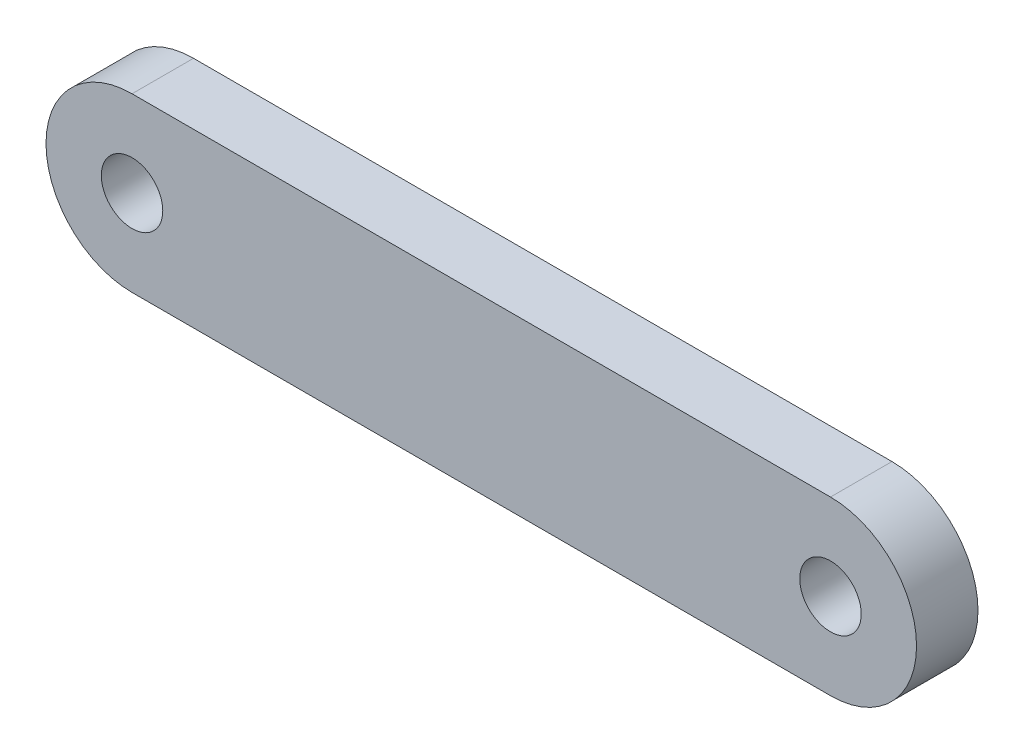
ISO-10303-21;
HEADER;
FILE_DESCRIPTION(('STEP AP214'),'2;1');
FILE_NAME('part.step','',(''),(''),'','','');
FILE_SCHEMA(('AUTOMOTIVE_DESIGN { 1 0 10303 214 1 1 1 1 }'));
ENDSEC;
DATA;
#1=APPLICATION_CONTEXT('core data for automotive mechanical design processes');
#2=APPLICATION_PROTOCOL_DEFINITION('international standard','automotive_design',2000,#1);
#3=PRODUCT_CONTEXT('',#1,'mechanical');
#4=PRODUCT('Part','Part','',(#3));
#5=PRODUCT_RELATED_PRODUCT_CATEGORY('part','',(#4));
#6=PRODUCT_DEFINITION_FORMATION('','',#4);
#7=PRODUCT_DEFINITION_CONTEXT('part definition',#1,'design');
#8=PRODUCT_DEFINITION('design','',#6,#7);
#9=PRODUCT_DEFINITION_SHAPE('','',#8);
#10=(LENGTH_UNIT() NAMED_UNIT(*) SI_UNIT(.MILLI.,.METRE.));
#11=(NAMED_UNIT(*) PLANE_ANGLE_UNIT() SI_UNIT($,.RADIAN.));
#12=(NAMED_UNIT(*) SI_UNIT($,.STERADIAN.) SOLID_ANGLE_UNIT());
#13=UNCERTAINTY_MEASURE_WITH_UNIT(LENGTH_MEASURE(1.E-05),#10,'distance_accuracy_value','');
#14=(GEOMETRIC_REPRESENTATION_CONTEXT(3) GLOBAL_UNCERTAINTY_ASSIGNED_CONTEXT((#13)) GLOBAL_UNIT_ASSIGNED_CONTEXT((#10,
#11,#12)) REPRESENTATION_CONTEXT('',''));
#15=CARTESIAN_POINT('',(0.,0.,0.));
#16=DIRECTION('',(0.,0.,1.));
#17=DIRECTION('',(1.,0.,0.));
#18=AXIS2_PLACEMENT_3D('',#15,#16,#17);
#19=CARTESIAN_POINT('',(53.4568064793297,0.253504378838441,6.35));
#20=DIRECTION('',(0.,0.,-1.));
#21=DIRECTION('',(-1.,0.,0.));
#22=AXIS2_PLACEMENT_3D('',#19,#20,#21);
#23=PLANE('',#22);
#24=CARTESIAN_POINT('',(53.4568064793297,0.253504378838441,6.35));
#25=DIRECTION('',(0.,0.,1.));
#26=DIRECTION('',(-1.,0.,0.));
#27=AXIS2_PLACEMENT_3D('',#24,#25,#26);
#28=CIRCLE('',#27,8.89);
#29=CARTESIAN_POINT('',(53.4568064793297,-8.63649562116156,6.35));
#30=VERTEX_POINT('',#29);
#31=CARTESIAN_POINT('',(53.4568064793297,9.14350437883844,6.35));
#32=VERTEX_POINT('',#31);
#33=EDGE_CURVE('E93',#30,#32,#28,.T.);
#34=ORIENTED_EDGE('',*,*,#33,.T.);
#35=DIRECTION('',(-1.,0.,0.));
#36=VECTOR('',#35,1.);
#37=CARTESIAN_POINT('',(-18.7121935206703,9.14350437883844,6.35));
#38=LINE('',#37,#36);
#39=CARTESIAN_POINT('',(-18.7121935206703,9.14350437883844,6.35));
#40=VERTEX_POINT('',#39);
#41=EDGE_CURVE('E88',#32,#40,#38,.T.);
#42=ORIENTED_EDGE('',*,*,#41,.T.);
#43=CARTESIAN_POINT('',(-18.7121935206703,0.253504378838441,6.35));
#44=DIRECTION('',(0.,0.,1.));
#45=DIRECTION('',(1.,0.,0.));
#46=AXIS2_PLACEMENT_3D('',#43,#44,#45);
#47=CIRCLE('',#46,8.89);
#48=CARTESIAN_POINT('',(-18.7121935206703,-8.63649562116156,6.35));
#49=VERTEX_POINT('',#48);
#50=EDGE_CURVE('E90',#40,#49,#47,.T.);
#51=ORIENTED_EDGE('',*,*,#50,.T.);
#52=DIRECTION('',(1.,0.,0.));
#53=VECTOR('',#52,1.);
#54=CARTESIAN_POINT('',(-18.7121935206703,-8.63649562116156,6.35));
#55=LINE('',#54,#53);
#56=EDGE_CURVE('E57',#49,#30,#55,.T.);
#57=ORIENTED_EDGE('',*,*,#56,.T.);
#58=EDGE_LOOP('',(#34,#42,#51,#57));
#59=FACE_BOUND('',#58,.T.);
#60=CARTESIAN_POINT('',(-18.7121935206703,0.253504378838441,6.35));
#61=DIRECTION('',(0.,0.,1.));
#62=DIRECTION('',(1.,0.,0.));
#63=AXIS2_PLACEMENT_3D('',#60,#61,#62);
#64=CIRCLE('',#63,3.175);
#65=CARTESIAN_POINT('',(-15.5371935206703,0.253504378838441,6.35));
#66=VERTEX_POINT('',#65);
#67=EDGE_CURVE('E106',#66,#66,#64,.T.);
#68=ORIENTED_EDGE('',*,*,#67,.F.);
#69=EDGE_LOOP('',(#68));
#70=FACE_BOUND('',#69,.T.);
#71=CARTESIAN_POINT('',(53.4568064793297,0.253504378838441,6.35));
#72=DIRECTION('',(0.,0.,1.));
#73=DIRECTION('',(1.,0.,0.));
#74=AXIS2_PLACEMENT_3D('',#71,#72,#73);
#75=CIRCLE('',#74,3.175);
#76=CARTESIAN_POINT('',(56.6318064793297,0.253504378838441,6.35));
#77=VERTEX_POINT('',#76);
#78=EDGE_CURVE('E122',#77,#77,#75,.T.);
#79=ORIENTED_EDGE('',*,*,#78,.F.);
#80=EDGE_LOOP('',(#79));
#81=FACE_BOUND('',#80,.T.);
#82=ADVANCED_FACE('F39',(#59,#70,#81),#23,.F.);
#83=CARTESIAN_POINT('',(53.4568064793297,0.253504378838441,0.));
#84=DIRECTION('',(0.,0.,-1.));
#85=DIRECTION('',(-1.,0.,0.));
#86=AXIS2_PLACEMENT_3D('',#83,#84,#85);
#87=PLANE('',#86);
#88=CARTESIAN_POINT('',(-18.7121935206703,0.253504378838441,0.));
#89=DIRECTION('',(0.,0.,1.));
#90=DIRECTION('',(1.,0.,0.));
#91=AXIS2_PLACEMENT_3D('',#88,#89,#90);
#92=CIRCLE('',#91,3.175);
#93=CARTESIAN_POINT('',(-15.5371935206703,0.253504378838441,0.));
#94=VERTEX_POINT('',#93);
#95=EDGE_CURVE('E120',#94,#94,#92,.T.);
#96=ORIENTED_EDGE('',*,*,#95,.T.);
#97=EDGE_LOOP('',(#96));
#98=FACE_BOUND('',#97,.T.);
#99=CARTESIAN_POINT('',(53.4568064793297,0.253504378838441,0.));
#100=DIRECTION('',(0.,0.,1.));
#101=DIRECTION('',(-1.,0.,0.));
#102=AXIS2_PLACEMENT_3D('',#99,#100,#101);
#103=CIRCLE('',#102,8.89);
#104=CARTESIAN_POINT('',(53.4568064793297,-8.63649562116156,0.));
#105=VERTEX_POINT('',#104);
#106=CARTESIAN_POINT('',(53.4568064793297,9.14350437883844,0.));
#107=VERTEX_POINT('',#106);
#108=EDGE_CURVE('E103',#105,#107,#103,.T.);
#109=ORIENTED_EDGE('',*,*,#108,.F.);
#110=DIRECTION('',(1.,0.,0.));
#111=VECTOR('',#110,1.);
#112=CARTESIAN_POINT('',(-18.7121935206703,-8.63649562116156,0.));
#113=LINE('',#112,#111);
#114=CARTESIAN_POINT('',(-18.7121935206703,-8.63649562116156,0.));
#115=VERTEX_POINT('',#114);
#116=EDGE_CURVE('E78',#115,#105,#113,.T.);
#117=ORIENTED_EDGE('',*,*,#116,.F.);
#118=CARTESIAN_POINT('',(-18.7121935206703,0.253504378838441,0.));
#119=DIRECTION('',(0.,0.,1.));
#120=DIRECTION('',(1.,0.,0.));
#121=AXIS2_PLACEMENT_3D('',#118,#119,#120);
#122=CIRCLE('',#121,8.89);
#123=CARTESIAN_POINT('',(-18.7121935206703,9.14350437883844,0.));
#124=VERTEX_POINT('',#123);
#125=EDGE_CURVE('E71',#124,#115,#122,.T.);
#126=ORIENTED_EDGE('',*,*,#125,.F.);
#127=DIRECTION('',(-1.,0.,0.));
#128=VECTOR('',#127,1.);
#129=CARTESIAN_POINT('',(-18.7121935206703,9.14350437883844,0.));
#130=LINE('',#129,#128);
#131=EDGE_CURVE('E92',#107,#124,#130,.T.);
#132=ORIENTED_EDGE('',*,*,#131,.F.);
#133=EDGE_LOOP('',(#109,#117,#126,#132));
#134=FACE_BOUND('',#133,.T.);
#135=CARTESIAN_POINT('',(53.4568064793297,0.253504378838441,0.));
#136=DIRECTION('',(0.,0.,1.));
#137=DIRECTION('',(1.,0.,0.));
#138=AXIS2_PLACEMENT_3D('',#135,#136,#137);
#139=CIRCLE('',#138,3.175);
#140=CARTESIAN_POINT('',(56.6318064793297,0.253504378838441,0.));
#141=VERTEX_POINT('',#140);
#142=EDGE_CURVE('E124',#141,#141,#139,.T.);
#143=ORIENTED_EDGE('',*,*,#142,.T.);
#144=EDGE_LOOP('',(#143));
#145=FACE_BOUND('',#144,.T.);
#146=ADVANCED_FACE('F111',(#98,#134,#145),#87,.T.);
#147=CARTESIAN_POINT('',(53.4568064793297,0.253504378838441,6.35));
#148=DIRECTION('',(0.,0.,-1.));
#149=DIRECTION('',(-1.,0.,0.));
#150=AXIS2_PLACEMENT_3D('',#147,#148,#149);
#151=CYLINDRICAL_SURFACE('',#150,8.89);
#152=ORIENTED_EDGE('',*,*,#108,.T.);
#153=DIRECTION('',(0.,0.,-1.));
#154=VECTOR('',#153,1.);
#155=CARTESIAN_POINT('',(53.4568064793297,9.14350437883844,6.35));
#156=LINE('',#155,#154);
#157=EDGE_CURVE('E11',#32,#107,#156,.T.);
#158=ORIENTED_EDGE('',*,*,#157,.F.);
#159=ORIENTED_EDGE('',*,*,#33,.F.);
#160=DIRECTION('',(0.,0.,-1.));
#161=VECTOR('',#160,1.);
#162=CARTESIAN_POINT('',(53.4568064793297,-8.63649562116156,6.35));
#163=LINE('',#162,#161);
#164=EDGE_CURVE('E97',#30,#105,#163,.T.);
#165=ORIENTED_EDGE('',*,*,#164,.T.);
#166=EDGE_LOOP('',(#152,#158,#159,#165));
#167=FACE_BOUND('',#166,.T.);
#168=ADVANCED_FACE('F41',(#167),#151,.T.);
#169=CARTESIAN_POINT('',(-18.7121935206703,9.14350437883844,6.35));
#170=DIRECTION('',(0.,-1.,0.));
#171=DIRECTION('',(0.,0.,-1.));
#172=AXIS2_PLACEMENT_3D('',#169,#170,#171);
#173=PLANE('',#172);
#174=ORIENTED_EDGE('',*,*,#131,.T.);
#175=DIRECTION('',(0.,0.,-1.));
#176=VECTOR('',#175,1.);
#177=CARTESIAN_POINT('',(-18.7121935206703,9.14350437883844,6.35));
#178=LINE('',#177,#176);
#179=EDGE_CURVE('E48',#40,#124,#178,.T.);
#180=ORIENTED_EDGE('',*,*,#179,.F.);
#181=ORIENTED_EDGE('',*,*,#41,.F.);
#182=ORIENTED_EDGE('',*,*,#157,.T.);
#183=EDGE_LOOP('',(#174,#180,#181,#182));
#184=FACE_BOUND('',#183,.T.);
#185=ADVANCED_FACE('F94',(#184),#173,.F.);
#186=CARTESIAN_POINT('',(-18.7121935206703,0.253504378838441,6.35));
#187=DIRECTION('',(0.,0.,-1.));
#188=DIRECTION('',(-1.,0.,0.));
#189=AXIS2_PLACEMENT_3D('',#186,#187,#188);
#190=CYLINDRICAL_SURFACE('',#189,8.89);
#191=ORIENTED_EDGE('',*,*,#125,.T.);
#192=DIRECTION('',(0.,0.,-1.));
#193=VECTOR('',#192,1.);
#194=CARTESIAN_POINT('',(-18.7121935206703,-8.63649562116156,6.35));
#195=LINE('',#194,#193);
#196=EDGE_CURVE('E96',#49,#115,#195,.T.);
#197=ORIENTED_EDGE('',*,*,#196,.F.);
#198=ORIENTED_EDGE('',*,*,#50,.F.);
#199=ORIENTED_EDGE('',*,*,#179,.T.);
#200=EDGE_LOOP('',(#191,#197,#198,#199));
#201=FACE_BOUND('',#200,.T.);
#202=ADVANCED_FACE('F100',(#201),#190,.T.);
#203=CARTESIAN_POINT('',(-18.7121935206703,-8.63649562116156,6.35));
#204=DIRECTION('',(0.,1.,0.));
#205=DIRECTION('',(0.,0.,1.));
#206=AXIS2_PLACEMENT_3D('',#203,#204,#205);
#207=PLANE('',#206);
#208=ORIENTED_EDGE('',*,*,#116,.T.);
#209=ORIENTED_EDGE('',*,*,#164,.F.);
#210=ORIENTED_EDGE('',*,*,#56,.F.);
#211=ORIENTED_EDGE('',*,*,#196,.T.);
#212=EDGE_LOOP('',(#208,#209,#210,#211));
#213=FACE_BOUND('',#212,.T.);
#214=ADVANCED_FACE('F112',(#213),#207,.F.);
#215=CARTESIAN_POINT('',(-18.7121935206703,0.253504378838441,6.35));
#216=DIRECTION('',(0.,0.,-1.));
#217=DIRECTION('',(-1.,0.,0.));
#218=AXIS2_PLACEMENT_3D('',#215,#216,#217);
#219=CYLINDRICAL_SURFACE('',#218,3.175);
#220=ORIENTED_EDGE('',*,*,#67,.T.);
#221=EDGE_LOOP('',(#220));
#222=FACE_BOUND('',#221,.T.);
#223=ORIENTED_EDGE('',*,*,#95,.F.);
#224=EDGE_LOOP('',(#223));
#225=FACE_BOUND('',#224,.T.);
#226=ADVANCED_FACE('F143',(#222,#225),#219,.F.);
#227=CARTESIAN_POINT('',(53.4568064793297,0.253504378838441,6.35));
#228=DIRECTION('',(0.,0.,-1.));
#229=DIRECTION('',(-1.,0.,0.));
#230=AXIS2_PLACEMENT_3D('',#227,#228,#229);
#231=CYLINDRICAL_SURFACE('',#230,3.175);
#232=ORIENTED_EDGE('',*,*,#78,.T.);
#233=EDGE_LOOP('',(#232));
#234=FACE_BOUND('',#233,.T.);
#235=ORIENTED_EDGE('',*,*,#142,.F.);
#236=EDGE_LOOP('',(#235));
#237=FACE_BOUND('',#236,.T.);
#238=ADVANCED_FACE('F128',(#234,#237),#231,.F.);
#239=CLOSED_SHELL('',(#82,#146,#168,#185,#202,#214,#226,#238));
#240=MANIFOLD_SOLID_BREP('B2',#239);
#241=ADVANCED_BREP_SHAPE_REPRESENTATION('',(#18,#240),#14);
#242=SHAPE_DEFINITION_REPRESENTATION(#9,#241);
ENDSEC;
END-ISO-10303-21;
